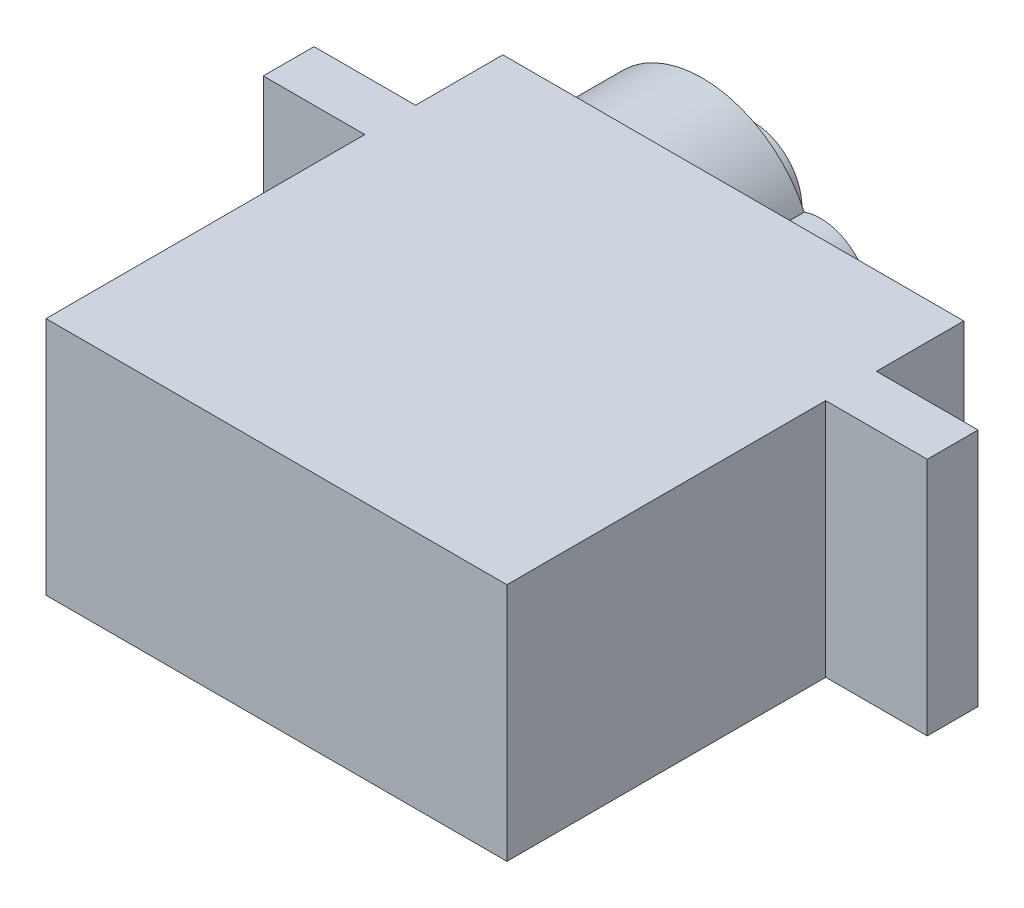
ISO-10303-21;
HEADER;
FILE_DESCRIPTION(('STEP AP214'),'2;1');
FILE_NAME('part.step','',(''),(''),'','','');
FILE_SCHEMA(('AUTOMOTIVE_DESIGN { 1 0 10303 214 1 1 1 1 }'));
ENDSEC;
DATA;
#1=APPLICATION_CONTEXT('core data for automotive mechanical design processes');
#2=APPLICATION_PROTOCOL_DEFINITION('international standard','automotive_design',2000,#1);
#3=PRODUCT_CONTEXT('',#1,'mechanical');
#4=PRODUCT('Part','Part','',(#3));
#5=PRODUCT_RELATED_PRODUCT_CATEGORY('part','',(#4));
#6=PRODUCT_DEFINITION_FORMATION('','',#4);
#7=PRODUCT_DEFINITION_CONTEXT('part definition',#1,'design');
#8=PRODUCT_DEFINITION('design','',#6,#7);
#9=PRODUCT_DEFINITION_SHAPE('','',#8);
#10=(LENGTH_UNIT() NAMED_UNIT(*) SI_UNIT(.MILLI.,.METRE.));
#11=(NAMED_UNIT(*) PLANE_ANGLE_UNIT() SI_UNIT($,.RADIAN.));
#12=(NAMED_UNIT(*) SI_UNIT($,.STERADIAN.) SOLID_ANGLE_UNIT());
#13=UNCERTAINTY_MEASURE_WITH_UNIT(LENGTH_MEASURE(1.E-05),#10,'distance_accuracy_value','');
#14=(GEOMETRIC_REPRESENTATION_CONTEXT(3) GLOBAL_UNCERTAINTY_ASSIGNED_CONTEXT((#13)) GLOBAL_UNIT_ASSIGNED_CONTEXT((#10,
#11,#12)) REPRESENTATION_CONTEXT('',''));
#15=CARTESIAN_POINT('',(0.,0.,0.));
#16=DIRECTION('',(0.,0.,1.));
#17=DIRECTION('',(1.,0.,0.));
#18=AXIS2_PLACEMENT_3D('',#15,#16,#17);
#19=CARTESIAN_POINT('',(-16.35,11.8,-6.94999999999999));
#20=DIRECTION('',(0.,0.,-1.));
#21=DIRECTION('',(-1.,0.,0.));
#22=AXIS2_PLACEMENT_3D('',#19,#20,#21);
#23=PLANE('',#22);
#24=DIRECTION('',(1.,0.,0.));
#25=VECTOR('',#24,1.);
#26=CARTESIAN_POINT('',(-16.35,0.,-6.94999999999999));
#27=LINE('',#26,#25);
#28=CARTESIAN_POINT('',(-16.35,0.,-6.94999999999999));
#29=VERTEX_POINT('',#28);
#30=CARTESIAN_POINT('',(-11.35,0.,-6.94999999999999));
#31=VERTEX_POINT('',#30);
#32=EDGE_CURVE('E156',#29,#31,#27,.T.);
#33=ORIENTED_EDGE('',*,*,#32,.F.);
#34=DIRECTION('',(0.,-1.,0.));
#35=VECTOR('',#34,1.);
#36=CARTESIAN_POINT('',(-16.35,11.8,-6.94999999999999));
#37=LINE('',#36,#35);
#38=CARTESIAN_POINT('',(-16.35,11.8,-6.94999999999999));
#39=VERTEX_POINT('',#38);
#40=EDGE_CURVE('E233',#39,#29,#37,.T.);
#41=ORIENTED_EDGE('',*,*,#40,.F.);
#42=DIRECTION('',(1.,0.,0.));
#43=VECTOR('',#42,1.);
#44=CARTESIAN_POINT('',(-16.35,11.8,-6.94999999999999));
#45=LINE('',#44,#43);
#46=CARTESIAN_POINT('',(-11.35,11.8,-6.94999999999999));
#47=VERTEX_POINT('',#46);
#48=EDGE_CURVE('E164',#39,#47,#45,.T.);
#49=ORIENTED_EDGE('',*,*,#48,.T.);
#50=DIRECTION('',(0.,-1.,0.));
#51=VECTOR('',#50,1.);
#52=CARTESIAN_POINT('',(-11.35,11.8,-6.94999999999999));
#53=LINE('',#52,#51);
#54=EDGE_CURVE('E200',#47,#31,#53,.T.);
#55=ORIENTED_EDGE('',*,*,#54,.T.);
#56=EDGE_LOOP('',(#33,#41,#49,#55));
#57=FACE_BOUND('',#56,.T.);
#58=ADVANCED_FACE('F39',(#57),#23,.T.);
#59=CARTESIAN_POINT('',(-16.35,11.8,-4.44999999999999));
#60=DIRECTION('',(-1.,0.,0.));
#61=DIRECTION('',(0.,0.,1.));
#62=AXIS2_PLACEMENT_3D('',#59,#60,#61);
#63=PLANE('',#62);
#64=DIRECTION('',(0.,0.,-1.));
#65=VECTOR('',#64,1.);
#66=CARTESIAN_POINT('',(-16.35,0.,-4.44999999999999));
#67=LINE('',#66,#65);
#68=CARTESIAN_POINT('',(-16.35,0.,-4.44999999999999));
#69=VERTEX_POINT('',#68);
#70=EDGE_CURVE('E168',#69,#29,#67,.T.);
#71=ORIENTED_EDGE('',*,*,#70,.F.);
#72=DIRECTION('',(0.,-1.,0.));
#73=VECTOR('',#72,1.);
#74=CARTESIAN_POINT('',(-16.35,11.8,-4.44999999999999));
#75=LINE('',#74,#73);
#76=CARTESIAN_POINT('',(-16.35,11.8,-4.44999999999999));
#77=VERTEX_POINT('',#76);
#78=EDGE_CURVE('E235',#77,#69,#75,.T.);
#79=ORIENTED_EDGE('',*,*,#78,.F.);
#80=DIRECTION('',(0.,0.,-1.));
#81=VECTOR('',#80,1.);
#82=CARTESIAN_POINT('',(-16.35,11.8,-4.44999999999999));
#83=LINE('',#82,#81);
#84=EDGE_CURVE('E198',#77,#39,#83,.T.);
#85=ORIENTED_EDGE('',*,*,#84,.T.);
#86=ORIENTED_EDGE('',*,*,#40,.T.);
#87=EDGE_LOOP('',(#71,#79,#85,#86));
#88=FACE_BOUND('',#87,.T.);
#89=ADVANCED_FACE('F275',(#88),#63,.T.);
#90=CARTESIAN_POINT('',(-11.35,11.8,-4.44999999999999));
#91=DIRECTION('',(0.,0.,1.));
#92=DIRECTION('',(1.,0.,0.));
#93=AXIS2_PLACEMENT_3D('',#90,#91,#92);
#94=PLANE('',#93);
#95=DIRECTION('',(-1.,0.,0.));
#96=VECTOR('',#95,1.);
#97=CARTESIAN_POINT('',(-11.35,0.,-4.44999999999999));
#98=LINE('',#97,#96);
#99=CARTESIAN_POINT('',(-11.35,0.,-4.44999999999999));
#100=VERTEX_POINT('',#99);
#101=EDGE_CURVE('E228',#100,#69,#98,.T.);
#102=ORIENTED_EDGE('',*,*,#101,.F.);
#103=DIRECTION('',(0.,-1.,0.));
#104=VECTOR('',#103,1.);
#105=CARTESIAN_POINT('',(-11.35,11.8,-4.44999999999999));
#106=LINE('',#105,#104);
#107=CARTESIAN_POINT('',(-11.35,11.8,-4.44999999999999));
#108=VERTEX_POINT('',#107);
#109=EDGE_CURVE('E237',#108,#100,#106,.T.);
#110=ORIENTED_EDGE('',*,*,#109,.F.);
#111=DIRECTION('',(-1.,0.,0.));
#112=VECTOR('',#111,1.);
#113=CARTESIAN_POINT('',(-11.35,11.8,-4.44999999999999));
#114=LINE('',#113,#112);
#115=EDGE_CURVE('E195',#108,#77,#114,.T.);
#116=ORIENTED_EDGE('',*,*,#115,.T.);
#117=ORIENTED_EDGE('',*,*,#78,.T.);
#118=EDGE_LOOP('',(#102,#110,#116,#117));
#119=FACE_BOUND('',#118,.T.);
#120=ADVANCED_FACE('F278',(#119),#94,.T.);
#121=CARTESIAN_POINT('',(-11.35,11.8,11.25));
#122=DIRECTION('',(-1.,0.,0.));
#123=DIRECTION('',(0.,0.,1.));
#124=AXIS2_PLACEMENT_3D('',#121,#122,#123);
#125=PLANE('',#124);
#126=DIRECTION('',(0.,0.,-1.));
#127=VECTOR('',#126,1.);
#128=CARTESIAN_POINT('',(-11.35,0.,11.25));
#129=LINE('',#128,#127);
#130=CARTESIAN_POINT('',(-11.35,0.,11.25));
#131=VERTEX_POINT('',#130);
#132=EDGE_CURVE('E225',#131,#100,#129,.T.);
#133=ORIENTED_EDGE('',*,*,#132,.F.);
#134=DIRECTION('',(0.,-1.,0.));
#135=VECTOR('',#134,1.);
#136=CARTESIAN_POINT('',(-11.35,11.8,11.25));
#137=LINE('',#136,#135);
#138=CARTESIAN_POINT('',(-11.35,11.8,11.25));
#139=VERTEX_POINT('',#138);
#140=EDGE_CURVE('E239',#139,#131,#137,.T.);
#141=ORIENTED_EDGE('',*,*,#140,.F.);
#142=DIRECTION('',(0.,0.,-1.));
#143=VECTOR('',#142,1.);
#144=CARTESIAN_POINT('',(-11.35,11.8,11.25));
#145=LINE('',#144,#143);
#146=EDGE_CURVE('E192',#139,#108,#145,.T.);
#147=ORIENTED_EDGE('',*,*,#146,.T.);
#148=ORIENTED_EDGE('',*,*,#109,.T.);
#149=EDGE_LOOP('',(#133,#141,#147,#148));
#150=FACE_BOUND('',#149,.T.);
#151=ADVANCED_FACE('F283',(#150),#125,.T.);
#152=CARTESIAN_POINT('',(11.35,11.8,11.25));
#153=DIRECTION('',(0.,0.,1.));
#154=DIRECTION('',(1.,0.,0.));
#155=AXIS2_PLACEMENT_3D('',#152,#153,#154);
#156=PLANE('',#155);
#157=DIRECTION('',(-1.,0.,0.));
#158=VECTOR('',#157,1.);
#159=CARTESIAN_POINT('',(11.35,0.,11.25));
#160=LINE('',#159,#158);
#161=CARTESIAN_POINT('',(11.35,0.,11.25));
#162=VERTEX_POINT('',#161);
#163=EDGE_CURVE('E222',#162,#131,#160,.T.);
#164=ORIENTED_EDGE('',*,*,#163,.F.);
#165=DIRECTION('',(0.,-1.,0.));
#166=VECTOR('',#165,1.);
#167=CARTESIAN_POINT('',(11.35,11.8,11.25));
#168=LINE('',#167,#166);
#169=CARTESIAN_POINT('',(11.35,11.8,11.25));
#170=VERTEX_POINT('',#169);
#171=EDGE_CURVE('E241',#170,#162,#168,.T.);
#172=ORIENTED_EDGE('',*,*,#171,.F.);
#173=DIRECTION('',(-1.,0.,0.));
#174=VECTOR('',#173,1.);
#175=CARTESIAN_POINT('',(11.35,11.8,11.25));
#176=LINE('',#175,#174);
#177=EDGE_CURVE('E189',#170,#139,#176,.T.);
#178=ORIENTED_EDGE('',*,*,#177,.T.);
#179=ORIENTED_EDGE('',*,*,#140,.T.);
#180=EDGE_LOOP('',(#164,#172,#178,#179));
#181=FACE_BOUND('',#180,.T.);
#182=ADVANCED_FACE('F286',(#181),#156,.T.);
#183=CARTESIAN_POINT('',(11.35,11.8,-4.45000000000001));
#184=DIRECTION('',(1.,0.,0.));
#185=DIRECTION('',(0.,0.,-1.));
#186=AXIS2_PLACEMENT_3D('',#183,#184,#185);
#187=PLANE('',#186);
#188=DIRECTION('',(0.,0.,1.));
#189=VECTOR('',#188,1.);
#190=CARTESIAN_POINT('',(11.35,0.,-4.45000000000001));
#191=LINE('',#190,#189);
#192=CARTESIAN_POINT('',(11.35,0.,-4.45000000000001));
#193=VERTEX_POINT('',#192);
#194=EDGE_CURVE('E219',#193,#162,#191,.T.);
#195=ORIENTED_EDGE('',*,*,#194,.F.);
#196=DIRECTION('',(0.,-1.,0.));
#197=VECTOR('',#196,1.);
#198=CARTESIAN_POINT('',(11.35,11.8,-4.45000000000001));
#199=LINE('',#198,#197);
#200=CARTESIAN_POINT('',(11.35,11.8,-4.45000000000001));
#201=VERTEX_POINT('',#200);
#202=EDGE_CURVE('E243',#201,#193,#199,.T.);
#203=ORIENTED_EDGE('',*,*,#202,.F.);
#204=DIRECTION('',(0.,0.,1.));
#205=VECTOR('',#204,1.);
#206=CARTESIAN_POINT('',(11.35,11.8,-4.45000000000001));
#207=LINE('',#206,#205);
#208=EDGE_CURVE('E186',#201,#170,#207,.T.);
#209=ORIENTED_EDGE('',*,*,#208,.T.);
#210=ORIENTED_EDGE('',*,*,#171,.T.);
#211=EDGE_LOOP('',(#195,#203,#209,#210));
#212=FACE_BOUND('',#211,.T.);
#213=ADVANCED_FACE('F291',(#212),#187,.T.);
#214=CARTESIAN_POINT('',(16.35,11.8,-4.45000000000001));
#215=DIRECTION('',(0.,0.,1.));
#216=DIRECTION('',(1.,0.,0.));
#217=AXIS2_PLACEMENT_3D('',#214,#215,#216);
#218=PLANE('',#217);
#219=DIRECTION('',(-1.,0.,0.));
#220=VECTOR('',#219,1.);
#221=CARTESIAN_POINT('',(16.35,0.,-4.45000000000001));
#222=LINE('',#221,#220);
#223=CARTESIAN_POINT('',(16.35,0.,-4.45000000000001));
#224=VERTEX_POINT('',#223);
#225=EDGE_CURVE('E216',#224,#193,#222,.T.);
#226=ORIENTED_EDGE('',*,*,#225,.F.);
#227=DIRECTION('',(0.,-1.,0.));
#228=VECTOR('',#227,1.);
#229=CARTESIAN_POINT('',(16.35,11.8,-4.45000000000001));
#230=LINE('',#229,#228);
#231=CARTESIAN_POINT('',(16.35,11.8,-4.45000000000001));
#232=VERTEX_POINT('',#231);
#233=EDGE_CURVE('E245',#232,#224,#230,.T.);
#234=ORIENTED_EDGE('',*,*,#233,.F.);
#235=DIRECTION('',(-1.,0.,0.));
#236=VECTOR('',#235,1.);
#237=CARTESIAN_POINT('',(16.35,11.8,-4.45000000000001));
#238=LINE('',#237,#236);
#239=EDGE_CURVE('E183',#232,#201,#238,.T.);
#240=ORIENTED_EDGE('',*,*,#239,.T.);
#241=ORIENTED_EDGE('',*,*,#202,.T.);
#242=EDGE_LOOP('',(#226,#234,#240,#241));
#243=FACE_BOUND('',#242,.T.);
#244=ADVANCED_FACE('F294',(#243),#218,.T.);
#245=CARTESIAN_POINT('',(16.35,11.8,-6.95));
#246=DIRECTION('',(1.,0.,0.));
#247=DIRECTION('',(0.,0.,-1.));
#248=AXIS2_PLACEMENT_3D('',#245,#246,#247);
#249=PLANE('',#248);
#250=DIRECTION('',(0.,0.,1.));
#251=VECTOR('',#250,1.);
#252=CARTESIAN_POINT('',(16.35,0.,-6.95));
#253=LINE('',#252,#251);
#254=CARTESIAN_POINT('',(16.35,0.,-6.95));
#255=VERTEX_POINT('',#254);
#256=EDGE_CURVE('E213',#255,#224,#253,.T.);
#257=ORIENTED_EDGE('',*,*,#256,.F.);
#258=DIRECTION('',(0.,-1.,0.));
#259=VECTOR('',#258,1.);
#260=CARTESIAN_POINT('',(16.35,11.8,-6.95));
#261=LINE('',#260,#259);
#262=CARTESIAN_POINT('',(16.35,11.8,-6.95));
#263=VERTEX_POINT('',#262);
#264=EDGE_CURVE('E247',#263,#255,#261,.T.);
#265=ORIENTED_EDGE('',*,*,#264,.F.);
#266=DIRECTION('',(0.,0.,1.));
#267=VECTOR('',#266,1.);
#268=CARTESIAN_POINT('',(16.35,11.8,-6.95));
#269=LINE('',#268,#267);
#270=EDGE_CURVE('E180',#263,#232,#269,.T.);
#271=ORIENTED_EDGE('',*,*,#270,.T.);
#272=ORIENTED_EDGE('',*,*,#233,.T.);
#273=EDGE_LOOP('',(#257,#265,#271,#272));
#274=FACE_BOUND('',#273,.T.);
#275=ADVANCED_FACE('F299',(#274),#249,.T.);
#276=CARTESIAN_POINT('',(11.35,11.8,-6.94999999999999));
#277=DIRECTION('',(0.,0.,-1.));
#278=DIRECTION('',(-1.,0.,0.));
#279=AXIS2_PLACEMENT_3D('',#276,#277,#278);
#280=PLANE('',#279);
#281=DIRECTION('',(1.,0.,0.));
#282=VECTOR('',#281,1.);
#283=CARTESIAN_POINT('',(11.35,0.,-6.94999999999999));
#284=LINE('',#283,#282);
#285=CARTESIAN_POINT('',(11.35,0.,-6.94999999999999));
#286=VERTEX_POINT('',#285);
#287=EDGE_CURVE('E210',#286,#255,#284,.T.);
#288=ORIENTED_EDGE('',*,*,#287,.F.);
#289=DIRECTION('',(0.,-1.,0.));
#290=VECTOR('',#289,1.);
#291=CARTESIAN_POINT('',(11.35,11.8,-6.94999999999999));
#292=LINE('',#291,#290);
#293=CARTESIAN_POINT('',(11.35,11.8,-6.94999999999999));
#294=VERTEX_POINT('',#293);
#295=EDGE_CURVE('E249',#294,#286,#292,.T.);
#296=ORIENTED_EDGE('',*,*,#295,.F.);
#297=DIRECTION('',(1.,0.,0.));
#298=VECTOR('',#297,1.);
#299=CARTESIAN_POINT('',(11.35,11.8,-6.94999999999999));
#300=LINE('',#299,#298);
#301=EDGE_CURVE('E177',#294,#263,#300,.T.);
#302=ORIENTED_EDGE('',*,*,#301,.T.);
#303=ORIENTED_EDGE('',*,*,#264,.T.);
#304=EDGE_LOOP('',(#288,#296,#302,#303));
#305=FACE_BOUND('',#304,.T.);
#306=ADVANCED_FACE('F302',(#305),#280,.T.);
#307=CARTESIAN_POINT('',(11.35,11.8,-11.25));
#308=DIRECTION('',(1.,0.,0.));
#309=DIRECTION('',(0.,0.,-1.));
#310=AXIS2_PLACEMENT_3D('',#307,#308,#309);
#311=PLANE('',#310);
#312=DIRECTION('',(0.,0.,1.));
#313=VECTOR('',#312,1.);
#314=CARTESIAN_POINT('',(11.35,0.,-11.25));
#315=LINE('',#314,#313);
#316=CARTESIAN_POINT('',(11.35,0.,-11.25));
#317=VERTEX_POINT('',#316);
#318=EDGE_CURVE('E207',#317,#286,#315,.T.);
#319=ORIENTED_EDGE('',*,*,#318,.F.);
#320=DIRECTION('',(0.,-1.,0.));
#321=VECTOR('',#320,1.);
#322=CARTESIAN_POINT('',(11.35,11.8,-11.25));
#323=LINE('',#322,#321);
#324=CARTESIAN_POINT('',(11.35,11.8,-11.25));
#325=VERTEX_POINT('',#324);
#326=EDGE_CURVE('E251',#325,#317,#323,.T.);
#327=ORIENTED_EDGE('',*,*,#326,.F.);
#328=DIRECTION('',(0.,0.,1.));
#329=VECTOR('',#328,1.);
#330=CARTESIAN_POINT('',(11.35,11.8,-11.25));
#331=LINE('',#330,#329);
#332=EDGE_CURVE('E174',#325,#294,#331,.T.);
#333=ORIENTED_EDGE('',*,*,#332,.T.);
#334=ORIENTED_EDGE('',*,*,#295,.T.);
#335=EDGE_LOOP('',(#319,#327,#333,#334));
#336=FACE_BOUND('',#335,.T.);
#337=ADVANCED_FACE('F305',(#336),#311,.T.);
#338=CARTESIAN_POINT('',(-11.35,11.8,-11.25));
#339=DIRECTION('',(0.,0.,-1.));
#340=DIRECTION('',(-1.,0.,0.));
#341=AXIS2_PLACEMENT_3D('',#338,#339,#340);
#342=PLANE('',#341);
#343=CARTESIAN_POINT('',(0.,5.9,-11.25));
#344=DIRECTION('',(0.,0.,-1.));
#345=DIRECTION('',(-1.,0.,0.));
#346=AXIS2_PLACEMENT_3D('',#343,#344,#345);
#347=CIRCLE('',#346,2.45);
#348=CARTESIAN_POINT('',(-0.807510729613732,8.21309887846558,-11.25));
#349=VERTEX_POINT('',#348);
#350=CARTESIAN_POINT('',(-0.80751072961373,3.58690112153442,-11.25));
#351=VERTEX_POINT('',#350);
#352=EDGE_CURVE('E155',#349,#351,#347,.T.);
#353=ORIENTED_EDGE('',*,*,#352,.F.);
#354=CARTESIAN_POINT('',(-5.825,5.9,-11.25));
#355=DIRECTION('',(0.,0.,-1.));
#356=DIRECTION('',(-1.,0.,0.));
#357=AXIS2_PLACEMENT_3D('',#354,#355,#356);
#358=CIRCLE('',#357,5.525);
#359=CARTESIAN_POINT('',(-11.35,5.9,-11.25));
#360=VERTEX_POINT('',#359);
#361=EDGE_CURVE('E46',#360,#349,#358,.T.);
#362=ORIENTED_EDGE('',*,*,#361,.F.);
#363=DIRECTION('',(0.,-1.,0.));
#364=VECTOR('',#363,1.);
#365=CARTESIAN_POINT('',(-11.35,11.8,-11.25));
#366=LINE('',#365,#364);
#367=CARTESIAN_POINT('',(-11.35,11.8,-11.25));
#368=VERTEX_POINT('',#367);
#369=EDGE_CURVE('E253',#368,#360,#366,.T.);
#370=ORIENTED_EDGE('',*,*,#369,.F.);
#371=DIRECTION('',(1.,0.,0.));
#372=VECTOR('',#371,1.);
#373=CARTESIAN_POINT('',(-11.35,11.8,-11.25));
#374=LINE('',#373,#372);
#375=EDGE_CURVE('E171',#368,#325,#374,.T.);
#376=ORIENTED_EDGE('',*,*,#375,.T.);
#377=ORIENTED_EDGE('',*,*,#326,.T.);
#378=DIRECTION('',(1.,0.,0.));
#379=VECTOR('',#378,1.);
#380=CARTESIAN_POINT('',(-11.35,0.,-11.25));
#381=LINE('',#380,#379);
#382=CARTESIAN_POINT('',(-11.35,0.,-11.25));
#383=VERTEX_POINT('',#382);
#384=EDGE_CURVE('E204',#383,#317,#381,.T.);
#385=ORIENTED_EDGE('',*,*,#384,.F.);
#386=EDGE_CURVE('E255',#360,#383,#366,.T.);
#387=ORIENTED_EDGE('',*,*,#386,.F.);
#388=EDGE_CURVE('E53',#351,#360,#358,.T.);
#389=ORIENTED_EDGE('',*,*,#388,.F.);
#390=EDGE_LOOP('',(#353,#362,#370,#376,#377,#385,#387,#389));
#391=FACE_BOUND('',#390,.T.);
#392=ADVANCED_FACE('F262',(#391),#342,.T.);
#393=CARTESIAN_POINT('',(-11.35,11.8,-6.94999999999999));
#394=DIRECTION('',(-1.,0.,0.));
#395=DIRECTION('',(0.,0.,1.));
#396=AXIS2_PLACEMENT_3D('',#393,#394,#395);
#397=PLANE('',#396);
#398=DIRECTION('',(0.,0.,-1.));
#399=VECTOR('',#398,1.);
#400=CARTESIAN_POINT('',(-11.35,0.,-6.94999999999999));
#401=LINE('',#400,#399);
#402=EDGE_CURVE('E159',#31,#383,#401,.T.);
#403=ORIENTED_EDGE('',*,*,#402,.F.);
#404=ORIENTED_EDGE('',*,*,#54,.F.);
#405=DIRECTION('',(0.,0.,-1.));
#406=VECTOR('',#405,1.);
#407=CARTESIAN_POINT('',(-11.35,11.8,-6.94999999999999));
#408=LINE('',#407,#406);
#409=EDGE_CURVE('E167',#47,#368,#408,.T.);
#410=ORIENTED_EDGE('',*,*,#409,.T.);
#411=ORIENTED_EDGE('',*,*,#369,.T.);
#412=ORIENTED_EDGE('',*,*,#386,.T.);
#413=EDGE_LOOP('',(#403,#404,#410,#411,#412));
#414=FACE_BOUND('',#413,.T.);
#415=ADVANCED_FACE('F261',(#414),#397,.T.);
#416=CARTESIAN_POINT('',(0.,11.8,0.));
#417=DIRECTION('',(0.,1.,0.));
#418=DIRECTION('',(0.,0.,1.));
#419=AXIS2_PLACEMENT_3D('',#416,#417,#418);
#420=PLANE('',#419);
#421=ORIENTED_EDGE('',*,*,#48,.F.);
#422=ORIENTED_EDGE('',*,*,#84,.F.);
#423=ORIENTED_EDGE('',*,*,#115,.F.);
#424=ORIENTED_EDGE('',*,*,#146,.F.);
#425=ORIENTED_EDGE('',*,*,#177,.F.);
#426=ORIENTED_EDGE('',*,*,#208,.F.);
#427=ORIENTED_EDGE('',*,*,#239,.F.);
#428=ORIENTED_EDGE('',*,*,#270,.F.);
#429=ORIENTED_EDGE('',*,*,#301,.F.);
#430=ORIENTED_EDGE('',*,*,#332,.F.);
#431=ORIENTED_EDGE('',*,*,#375,.F.);
#432=ORIENTED_EDGE('',*,*,#409,.F.);
#433=EDGE_LOOP('',(#421,#422,#423,#424,#425,#426,#427,#428,#429,#430,#431,#432));
#434=FACE_BOUND('',#433,.T.);
#435=ADVANCED_FACE('F272',(#434),#420,.T.);
#436=CARTESIAN_POINT('',(0.,0.,0.));
#437=DIRECTION('',(0.,1.,0.));
#438=DIRECTION('',(0.,0.,1.));
#439=AXIS2_PLACEMENT_3D('',#436,#437,#438);
#440=PLANE('',#439);
#441=ORIENTED_EDGE('',*,*,#32,.T.);
#442=ORIENTED_EDGE('',*,*,#402,.T.);
#443=ORIENTED_EDGE('',*,*,#384,.T.);
#444=ORIENTED_EDGE('',*,*,#318,.T.);
#445=ORIENTED_EDGE('',*,*,#287,.T.);
#446=ORIENTED_EDGE('',*,*,#256,.T.);
#447=ORIENTED_EDGE('',*,*,#225,.T.);
#448=ORIENTED_EDGE('',*,*,#194,.T.);
#449=ORIENTED_EDGE('',*,*,#163,.T.);
#450=ORIENTED_EDGE('',*,*,#132,.T.);
#451=ORIENTED_EDGE('',*,*,#101,.T.);
#452=ORIENTED_EDGE('',*,*,#70,.T.);
#453=EDGE_LOOP('',(#441,#442,#443,#444,#445,#446,#447,#448,#449,#450,#451,#452));
#454=FACE_BOUND('',#453,.T.);
#455=ADVANCED_FACE('F265',(#454),#440,.F.);
#456=CARTESIAN_POINT('',(0.,5.9,-15.55));
#457=DIRECTION('',(0.,0.,1.));
#458=DIRECTION('',(1.,0.,0.));
#459=AXIS2_PLACEMENT_3D('',#456,#457,#458);
#460=CYLINDRICAL_SURFACE('',#459,2.45);
#461=ORIENTED_EDGE('',*,*,#352,.T.);
#462=DIRECTION('',(0.,0.,1.));
#463=VECTOR('',#462,1.);
#464=CARTESIAN_POINT('',(-0.807510729613731,3.58690112153442,-15.55));
#465=LINE('',#464,#463);
#466=CARTESIAN_POINT('',(-0.807510729613731,3.58690112153442,-15.55));
#467=VERTEX_POINT('',#466);
#468=EDGE_CURVE('E143',#467,#351,#465,.T.);
#469=ORIENTED_EDGE('',*,*,#468,.F.);
#470=CARTESIAN_POINT('',(0.,5.9,-15.55));
#471=DIRECTION('',(0.,0.,-1.));
#472=DIRECTION('',(-1.,0.,0.));
#473=AXIS2_PLACEMENT_3D('',#470,#471,#472);
#474=CIRCLE('',#473,2.45);
#475=CARTESIAN_POINT('',(-0.807510729613733,8.21309887846558,-15.55));
#476=VERTEX_POINT('',#475);
#477=EDGE_CURVE('E149',#476,#467,#474,.T.);
#478=ORIENTED_EDGE('',*,*,#477,.F.);
#479=DIRECTION('',(0.,0.,1.));
#480=VECTOR('',#479,1.);
#481=CARTESIAN_POINT('',(-0.807510729613733,8.21309887846558,-15.55));
#482=LINE('',#481,#480);
#483=EDGE_CURVE('E146',#476,#349,#482,.T.);
#484=ORIENTED_EDGE('',*,*,#483,.T.);
#485=EDGE_LOOP('',(#461,#469,#478,#484));
#486=FACE_BOUND('',#485,.T.);
#487=ADVANCED_FACE('F154',(#486),#460,.T.);
#488=CARTESIAN_POINT('',(-5.825,5.9,-15.55));
#489=DIRECTION('',(0.,0.,1.));
#490=DIRECTION('',(1.,0.,0.));
#491=AXIS2_PLACEMENT_3D('',#488,#489,#490);
#492=CYLINDRICAL_SURFACE('',#491,5.525);
#493=ORIENTED_EDGE('',*,*,#388,.T.);
#494=ORIENTED_EDGE('',*,*,#361,.T.);
#495=ORIENTED_EDGE('',*,*,#483,.F.);
#496=CARTESIAN_POINT('',(-5.825,5.9,-15.55));
#497=DIRECTION('',(0.,0.,-1.));
#498=DIRECTION('',(-1.,0.,0.));
#499=AXIS2_PLACEMENT_3D('',#496,#497,#498);
#500=CIRCLE('',#499,5.525);
#501=EDGE_CURVE('E139',#467,#476,#500,.T.);
#502=ORIENTED_EDGE('',*,*,#501,.F.);
#503=ORIENTED_EDGE('',*,*,#468,.T.);
#504=EDGE_LOOP('',(#493,#494,#495,#502,#503));
#505=FACE_BOUND('',#504,.T.);
#506=ADVANCED_FACE('F141',(#505),#492,.T.);
#507=CARTESIAN_POINT('',(0.,0.,-15.55));
#508=DIRECTION('',(0.,0.,-1.));
#509=DIRECTION('',(-1.,0.,0.));
#510=AXIS2_PLACEMENT_3D('',#507,#508,#509);
#511=PLANE('',#510);
#512=CARTESIAN_POINT('',(-5.82500000000002,5.9,-15.55));
#513=DIRECTION('',(0.,0.,-1.));
#514=DIRECTION('',(-1.,0.,0.));
#515=AXIS2_PLACEMENT_3D('',#512,#513,#514);
#516=CIRCLE('',#515,2.4);
#517=CARTESIAN_POINT('',(-8.22500000000002,5.9,-15.55));
#518=VERTEX_POINT('',#517);
#519=EDGE_CURVE('E460',#518,#518,#516,.T.);
#520=ORIENTED_EDGE('',*,*,#519,.F.);
#521=EDGE_LOOP('',(#520));
#522=FACE_BOUND('',#521,.T.);
#523=ORIENTED_EDGE('',*,*,#477,.T.);
#524=ORIENTED_EDGE('',*,*,#501,.T.);
#525=EDGE_LOOP('',(#523,#524));
#526=FACE_BOUND('',#525,.T.);
#527=ADVANCED_FACE('F151',(#522,#526),#511,.T.);
#528=CARTESIAN_POINT('',(-5.82500000000002,5.9,-18.05));
#529=DIRECTION('',(0.,0.,1.));
#530=DIRECTION('',(1.,0.,0.));
#531=AXIS2_PLACEMENT_3D('',#528,#529,#530);
#532=CYLINDRICAL_SURFACE('',#531,0.575);
#533=CARTESIAN_POINT('',(-5.82500000000002,5.9,-18.05));
#534=DIRECTION('',(0.,0.,-1.));
#535=DIRECTION('',(-1.,0.,0.));
#536=AXIS2_PLACEMENT_3D('',#533,#534,#535);
#537=CIRCLE('',#536,0.575);
#538=CARTESIAN_POINT('',(-6.40000000000002,5.9,-18.05));
#539=VERTEX_POINT('',#538);
#540=EDGE_CURVE('E454',#539,#539,#537,.T.);
#541=ORIENTED_EDGE('',*,*,#540,.T.);
#542=EDGE_LOOP('',(#541));
#543=FACE_BOUND('',#542,.T.);
#544=CARTESIAN_POINT('',(-5.82500000000002,5.9,-15.55));
#545=DIRECTION('',(0.,0.,-1.));
#546=DIRECTION('',(-1.,0.,0.));
#547=AXIS2_PLACEMENT_3D('',#544,#545,#546);
#548=CIRCLE('',#547,0.575);
#549=CARTESIAN_POINT('',(-6.40000000000002,5.9,-15.55));
#550=VERTEX_POINT('',#549);
#551=EDGE_CURVE('E11',#550,#550,#548,.F.);
#552=ORIENTED_EDGE('',*,*,#551,.T.);
#553=EDGE_LOOP('',(#552));
#554=FACE_BOUND('',#553,.T.);
#555=ADVANCED_FACE('F400',(#543,#554),#532,.F.);
#556=CARTESIAN_POINT('',(-5.82500000000002,5.9,-18.05));
#557=DIRECTION('',(0.,0.,1.));
#558=DIRECTION('',(1.,0.,0.));
#559=AXIS2_PLACEMENT_3D('',#556,#557,#558);
#560=CYLINDRICAL_SURFACE('',#559,2.4);
#561=CARTESIAN_POINT('',(-5.82500000000002,5.9,-18.05));
#562=DIRECTION('',(0.,0.,-1.));
#563=DIRECTION('',(-1.,0.,0.));
#564=AXIS2_PLACEMENT_3D('',#561,#562,#563);
#565=CIRCLE('',#564,2.4);
#566=CARTESIAN_POINT('',(-8.22500000000002,5.9,-18.05));
#567=VERTEX_POINT('',#566);
#568=EDGE_CURVE('E457',#567,#567,#565,.T.);
#569=ORIENTED_EDGE('',*,*,#568,.F.);
#570=EDGE_LOOP('',(#569));
#571=FACE_BOUND('',#570,.T.);
#572=ORIENTED_EDGE('',*,*,#519,.T.);
#573=EDGE_LOOP('',(#572));
#574=FACE_BOUND('',#573,.T.);
#575=ADVANCED_FACE('F412',(#571,#574),#560,.T.);
#576=CARTESIAN_POINT('',(0.,0.,-18.05));
#577=DIRECTION('',(0.,0.,-1.));
#578=DIRECTION('',(-1.,0.,0.));
#579=AXIS2_PLACEMENT_3D('',#576,#577,#578);
#580=PLANE('',#579);
#581=ORIENTED_EDGE('',*,*,#540,.F.);
#582=EDGE_LOOP('',(#581));
#583=FACE_BOUND('',#582,.T.);
#584=ORIENTED_EDGE('',*,*,#568,.T.);
#585=EDGE_LOOP('',(#584));
#586=FACE_BOUND('',#585,.T.);
#587=ADVANCED_FACE('F423',(#583,#586),#580,.T.);
#588=ORIENTED_EDGE('',*,*,#551,.F.);
#589=EDGE_LOOP('',(#588));
#590=FACE_BOUND('',#589,.T.);
#591=ADVANCED_FACE('F403',(#590),#511,.T.);
#592=CLOSED_SHELL('',(#58,#89,#120,#151,#182,#213,#244,#275,#306,#337,#392,#415,#435,#455,#487,
#506,#527,#555,#575,#587,#591));
#593=MANIFOLD_SOLID_BREP('B2',#592);
#594=ADVANCED_BREP_SHAPE_REPRESENTATION('',(#18,#593),#14);
#595=SHAPE_DEFINITION_REPRESENTATION(#9,#594);
ENDSEC;
END-ISO-10303-21;
